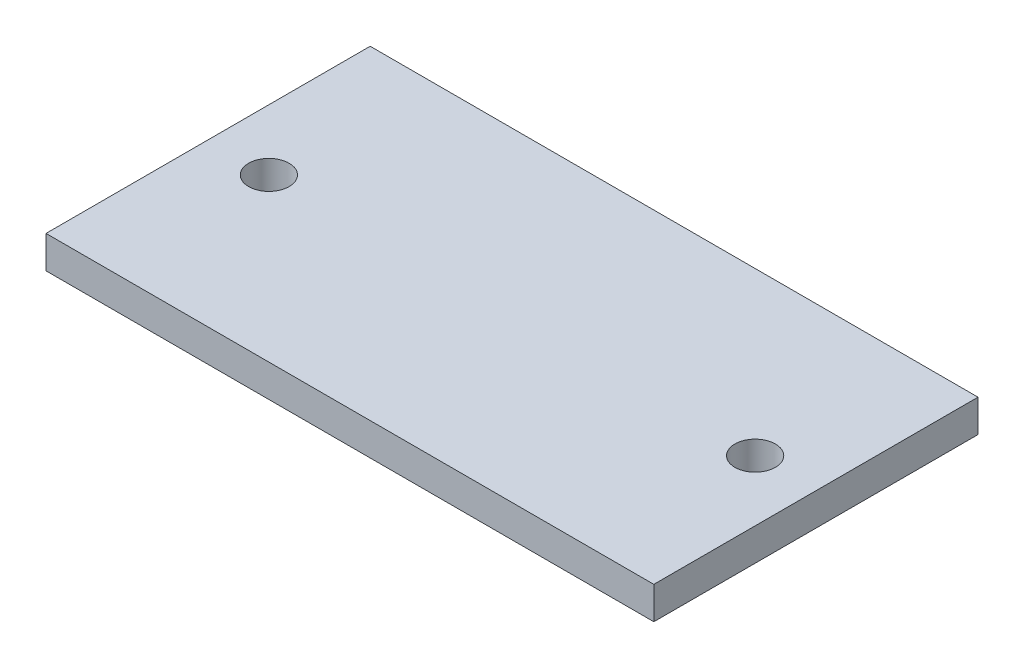
ISO-10303-21;
HEADER;
FILE_DESCRIPTION(('STEP AP214'),'2;1');
FILE_NAME('part.step','',(''),(''),'','','');
FILE_SCHEMA(('AUTOMOTIVE_DESIGN { 1 0 10303 214 1 1 1 1 }'));
ENDSEC;
DATA;
#1=APPLICATION_CONTEXT('core data for automotive mechanical design processes');
#2=APPLICATION_PROTOCOL_DEFINITION('international standard','automotive_design',2000,#1);
#3=PRODUCT_CONTEXT('',#1,'mechanical');
#4=PRODUCT('Part','Part','',(#3));
#5=PRODUCT_RELATED_PRODUCT_CATEGORY('part','',(#4));
#6=PRODUCT_DEFINITION_FORMATION('','',#4);
#7=PRODUCT_DEFINITION_CONTEXT('part definition',#1,'design');
#8=PRODUCT_DEFINITION('design','',#6,#7);
#9=PRODUCT_DEFINITION_SHAPE('','',#8);
#10=(LENGTH_UNIT() NAMED_UNIT(*) SI_UNIT(.MILLI.,.METRE.));
#11=(NAMED_UNIT(*) PLANE_ANGLE_UNIT() SI_UNIT($,.RADIAN.));
#12=(NAMED_UNIT(*) SI_UNIT($,.STERADIAN.) SOLID_ANGLE_UNIT());
#13=UNCERTAINTY_MEASURE_WITH_UNIT(LENGTH_MEASURE(1.E-05),#10,'distance_accuracy_value','');
#14=(GEOMETRIC_REPRESENTATION_CONTEXT(3) GLOBAL_UNCERTAINTY_ASSIGNED_CONTEXT((#13)) GLOBAL_UNIT_ASSIGNED_CONTEXT((#10,
#11,#12)) REPRESENTATION_CONTEXT('',''));
#15=CARTESIAN_POINT('',(0.,0.,0.));
#16=DIRECTION('',(0.,0.,1.));
#17=DIRECTION('',(1.,0.,0.));
#18=AXIS2_PLACEMENT_3D('',#15,#16,#17);
#19=CARTESIAN_POINT('',(0.,0.8,-8.));
#20=DIRECTION('',(-1.,0.,0.));
#21=DIRECTION('',(0.,0.,1.));
#22=AXIS2_PLACEMENT_3D('',#19,#20,#21);
#23=PLANE('',#22);
#24=DIRECTION('',(0.,0.,-1.));
#25=VECTOR('',#24,1.);
#26=CARTESIAN_POINT('',(0.,0.,-8.));
#27=LINE('',#26,#25);
#28=CARTESIAN_POINT('',(0.,0.,0.));
#29=VERTEX_POINT('',#28);
#30=CARTESIAN_POINT('',(0.,0.,-8.));
#31=VERTEX_POINT('',#30);
#32=EDGE_CURVE('E96',#29,#31,#27,.T.);
#33=ORIENTED_EDGE('',*,*,#32,.T.);
#34=DIRECTION('',(0.,-1.,0.));
#35=VECTOR('',#34,1.);
#36=CARTESIAN_POINT('',(0.,0.8,-8.));
#37=LINE('',#36,#35);
#38=CARTESIAN_POINT('',(0.,0.8,-8.));
#39=VERTEX_POINT('',#38);
#40=EDGE_CURVE('E11',#39,#31,#37,.T.);
#41=ORIENTED_EDGE('',*,*,#40,.F.);
#42=DIRECTION('',(0.,0.,-1.));
#43=VECTOR('',#42,1.);
#44=CARTESIAN_POINT('',(0.,0.8,-8.));
#45=LINE('',#44,#43);
#46=CARTESIAN_POINT('',(0.,0.8,0.));
#47=VERTEX_POINT('',#46);
#48=EDGE_CURVE('E84',#47,#39,#45,.T.);
#49=ORIENTED_EDGE('',*,*,#48,.F.);
#50=DIRECTION('',(0.,-1.,0.));
#51=VECTOR('',#50,1.);
#52=CARTESIAN_POINT('',(0.,0.8,0.));
#53=LINE('',#52,#51);
#54=EDGE_CURVE('E92',#47,#29,#53,.T.);
#55=ORIENTED_EDGE('',*,*,#54,.T.);
#56=EDGE_LOOP('',(#33,#41,#49,#55));
#57=FACE_BOUND('',#56,.T.);
#58=ADVANCED_FACE('F33',(#57),#23,.F.);
#59=CARTESIAN_POINT('',(0.,0.8,-8.));
#60=DIRECTION('',(0.,0.,1.));
#61=DIRECTION('',(1.,0.,0.));
#62=AXIS2_PLACEMENT_3D('',#59,#60,#61);
#63=PLANE('',#62);
#64=DIRECTION('',(-1.,0.,0.));
#65=VECTOR('',#64,1.);
#66=CARTESIAN_POINT('',(0.,0.,-8.));
#67=LINE('',#66,#65);
#68=CARTESIAN_POINT('',(-15.,0.,-8.));
#69=VERTEX_POINT('',#68);
#70=EDGE_CURVE('E88',#31,#69,#67,.T.);
#71=ORIENTED_EDGE('',*,*,#70,.T.);
#72=DIRECTION('',(0.,-1.,0.));
#73=VECTOR('',#72,1.);
#74=CARTESIAN_POINT('',(-15.,0.8,-8.));
#75=LINE('',#74,#73);
#76=CARTESIAN_POINT('',(-15.,0.8,-8.));
#77=VERTEX_POINT('',#76);
#78=EDGE_CURVE('E41',#77,#69,#75,.T.);
#79=ORIENTED_EDGE('',*,*,#78,.F.);
#80=DIRECTION('',(-1.,0.,0.));
#81=VECTOR('',#80,1.);
#82=CARTESIAN_POINT('',(0.,0.8,-8.));
#83=LINE('',#82,#81);
#84=EDGE_CURVE('E79',#39,#77,#83,.T.);
#85=ORIENTED_EDGE('',*,*,#84,.F.);
#86=ORIENTED_EDGE('',*,*,#40,.T.);
#87=EDGE_LOOP('',(#71,#79,#85,#86));
#88=FACE_BOUND('',#87,.T.);
#89=ADVANCED_FACE('F87',(#88),#63,.F.);
#90=CARTESIAN_POINT('',(-15.,0.8,-8.));
#91=DIRECTION('',(1.,0.,0.));
#92=DIRECTION('',(0.,0.,-1.));
#93=AXIS2_PLACEMENT_3D('',#90,#91,#92);
#94=PLANE('',#93);
#95=DIRECTION('',(0.,0.,1.));
#96=VECTOR('',#95,1.);
#97=CARTESIAN_POINT('',(-15.,0.,-8.));
#98=LINE('',#97,#96);
#99=CARTESIAN_POINT('',(-15.,0.,0.));
#100=VERTEX_POINT('',#99);
#101=EDGE_CURVE('E66',#69,#100,#98,.T.);
#102=ORIENTED_EDGE('',*,*,#101,.T.);
#103=DIRECTION('',(0.,-1.,0.));
#104=VECTOR('',#103,1.);
#105=CARTESIAN_POINT('',(-15.,0.8,0.));
#106=LINE('',#105,#104);
#107=CARTESIAN_POINT('',(-15.,0.8,0.));
#108=VERTEX_POINT('',#107);
#109=EDGE_CURVE('E89',#108,#100,#106,.T.);
#110=ORIENTED_EDGE('',*,*,#109,.F.);
#111=DIRECTION('',(0.,0.,1.));
#112=VECTOR('',#111,1.);
#113=CARTESIAN_POINT('',(-15.,0.8,-8.));
#114=LINE('',#113,#112);
#115=EDGE_CURVE('E82',#77,#108,#114,.T.);
#116=ORIENTED_EDGE('',*,*,#115,.F.);
#117=ORIENTED_EDGE('',*,*,#78,.T.);
#118=EDGE_LOOP('',(#102,#110,#116,#117));
#119=FACE_BOUND('',#118,.T.);
#120=ADVANCED_FACE('F90',(#119),#94,.F.);
#121=CARTESIAN_POINT('',(0.,0.8,0.));
#122=DIRECTION('',(0.,0.,-1.));
#123=DIRECTION('',(-1.,0.,0.));
#124=AXIS2_PLACEMENT_3D('',#121,#122,#123);
#125=PLANE('',#124);
#126=DIRECTION('',(1.,0.,0.));
#127=VECTOR('',#126,1.);
#128=CARTESIAN_POINT('',(0.,0.,0.));
#129=LINE('',#128,#127);
#130=EDGE_CURVE('E72',#100,#29,#129,.T.);
#131=ORIENTED_EDGE('',*,*,#130,.T.);
#132=ORIENTED_EDGE('',*,*,#54,.F.);
#133=DIRECTION('',(1.,0.,0.));
#134=VECTOR('',#133,1.);
#135=CARTESIAN_POINT('',(0.,0.8,0.));
#136=LINE('',#135,#134);
#137=EDGE_CURVE('E49',#108,#47,#136,.T.);
#138=ORIENTED_EDGE('',*,*,#137,.F.);
#139=ORIENTED_EDGE('',*,*,#109,.T.);
#140=EDGE_LOOP('',(#131,#132,#138,#139));
#141=FACE_BOUND('',#140,.T.);
#142=ADVANCED_FACE('F104',(#141),#125,.F.);
#143=CARTESIAN_POINT('',(0.,0.8,0.));
#144=DIRECTION('',(0.,-1.,0.));
#145=DIRECTION('',(0.,0.,-1.));
#146=AXIS2_PLACEMENT_3D('',#143,#144,#145);
#147=PLANE('',#146);
#148=CARTESIAN_POINT('',(-1.5,0.8,-4.));
#149=DIRECTION('',(0.,1.,0.));
#150=DIRECTION('',(0.,0.,1.));
#151=AXIS2_PLACEMENT_3D('',#148,#149,#150);
#152=CIRCLE('',#151,0.499999999999999);
#153=CARTESIAN_POINT('',(-1.5,0.8,-3.5));
#154=VERTEX_POINT('',#153);
#155=EDGE_CURVE('E116',#154,#154,#152,.T.);
#156=ORIENTED_EDGE('',*,*,#155,.F.);
#157=EDGE_LOOP('',(#156));
#158=FACE_BOUND('',#157,.T.);
#159=CARTESIAN_POINT('',(-13.5,0.8,-4.));
#160=DIRECTION('',(0.,1.,0.));
#161=DIRECTION('',(0.,0.,1.));
#162=AXIS2_PLACEMENT_3D('',#159,#160,#161);
#163=CIRCLE('',#162,0.499999999999999);
#164=CARTESIAN_POINT('',(-13.5,0.8,-3.5));
#165=VERTEX_POINT('',#164);
#166=EDGE_CURVE('E110',#165,#165,#163,.T.);
#167=ORIENTED_EDGE('',*,*,#166,.F.);
#168=EDGE_LOOP('',(#167));
#169=FACE_BOUND('',#168,.T.);
#170=ORIENTED_EDGE('',*,*,#48,.T.);
#171=ORIENTED_EDGE('',*,*,#84,.T.);
#172=ORIENTED_EDGE('',*,*,#115,.T.);
#173=ORIENTED_EDGE('',*,*,#137,.T.);
#174=EDGE_LOOP('',(#170,#171,#172,#173));
#175=FACE_BOUND('',#174,.T.);
#176=ADVANCED_FACE('F80',(#158,#169,#175),#147,.F.);
#177=CARTESIAN_POINT('',(0.,0.,0.));
#178=DIRECTION('',(0.,-1.,0.));
#179=DIRECTION('',(0.,0.,-1.));
#180=AXIS2_PLACEMENT_3D('',#177,#178,#179);
#181=PLANE('',#180);
#182=CARTESIAN_POINT('',(-1.5,0.,-4.));
#183=DIRECTION('',(0.,1.,0.));
#184=DIRECTION('',(0.,0.,1.));
#185=AXIS2_PLACEMENT_3D('',#182,#183,#184);
#186=CIRCLE('',#185,0.499999999999999);
#187=CARTESIAN_POINT('',(-1.5,0.,-3.5));
#188=VERTEX_POINT('',#187);
#189=EDGE_CURVE('E113',#188,#188,#186,.T.);
#190=ORIENTED_EDGE('',*,*,#189,.T.);
#191=EDGE_LOOP('',(#190));
#192=FACE_BOUND('',#191,.T.);
#193=CARTESIAN_POINT('',(-13.5,0.,-4.));
#194=DIRECTION('',(0.,1.,0.));
#195=DIRECTION('',(0.,0.,1.));
#196=AXIS2_PLACEMENT_3D('',#193,#194,#195);
#197=CIRCLE('',#196,0.499999999999999);
#198=CARTESIAN_POINT('',(-13.5,0.,-3.5));
#199=VERTEX_POINT('',#198);
#200=EDGE_CURVE('E99',#199,#199,#197,.T.);
#201=ORIENTED_EDGE('',*,*,#200,.T.);
#202=EDGE_LOOP('',(#201));
#203=FACE_BOUND('',#202,.T.);
#204=ORIENTED_EDGE('',*,*,#32,.F.);
#205=ORIENTED_EDGE('',*,*,#130,.F.);
#206=ORIENTED_EDGE('',*,*,#101,.F.);
#207=ORIENTED_EDGE('',*,*,#70,.F.);
#208=EDGE_LOOP('',(#204,#205,#206,#207));
#209=FACE_BOUND('',#208,.T.);
#210=ADVANCED_FACE('F107',(#192,#203,#209),#181,.T.);
#211=CARTESIAN_POINT('',(-13.5,0.,-4.));
#212=DIRECTION('',(0.,1.,0.));
#213=DIRECTION('',(0.,0.,1.));
#214=AXIS2_PLACEMENT_3D('',#211,#212,#213);
#215=CYLINDRICAL_SURFACE('',#214,0.499999999999999);
#216=ORIENTED_EDGE('',*,*,#200,.F.);
#217=EDGE_LOOP('',(#216));
#218=FACE_BOUND('',#217,.T.);
#219=ORIENTED_EDGE('',*,*,#166,.T.);
#220=EDGE_LOOP('',(#219));
#221=FACE_BOUND('',#220,.T.);
#222=ADVANCED_FACE('F127',(#218,#221),#215,.F.);
#223=CARTESIAN_POINT('',(-1.5,0.,-4.));
#224=DIRECTION('',(0.,1.,0.));
#225=DIRECTION('',(0.,0.,1.));
#226=AXIS2_PLACEMENT_3D('',#223,#224,#225);
#227=CYLINDRICAL_SURFACE('',#226,0.499999999999999);
#228=ORIENTED_EDGE('',*,*,#189,.F.);
#229=EDGE_LOOP('',(#228));
#230=FACE_BOUND('',#229,.T.);
#231=ORIENTED_EDGE('',*,*,#155,.T.);
#232=EDGE_LOOP('',(#231));
#233=FACE_BOUND('',#232,.T.);
#234=ADVANCED_FACE('F124',(#230,#233),#227,.F.);
#235=CLOSED_SHELL('',(#58,#89,#120,#142,#176,#210,#222,#234));
#236=MANIFOLD_SOLID_BREP('B2',#235);
#237=ADVANCED_BREP_SHAPE_REPRESENTATION('',(#18,#236),#14);
#238=SHAPE_DEFINITION_REPRESENTATION(#9,#237);
ENDSEC;
END-ISO-10303-21;
